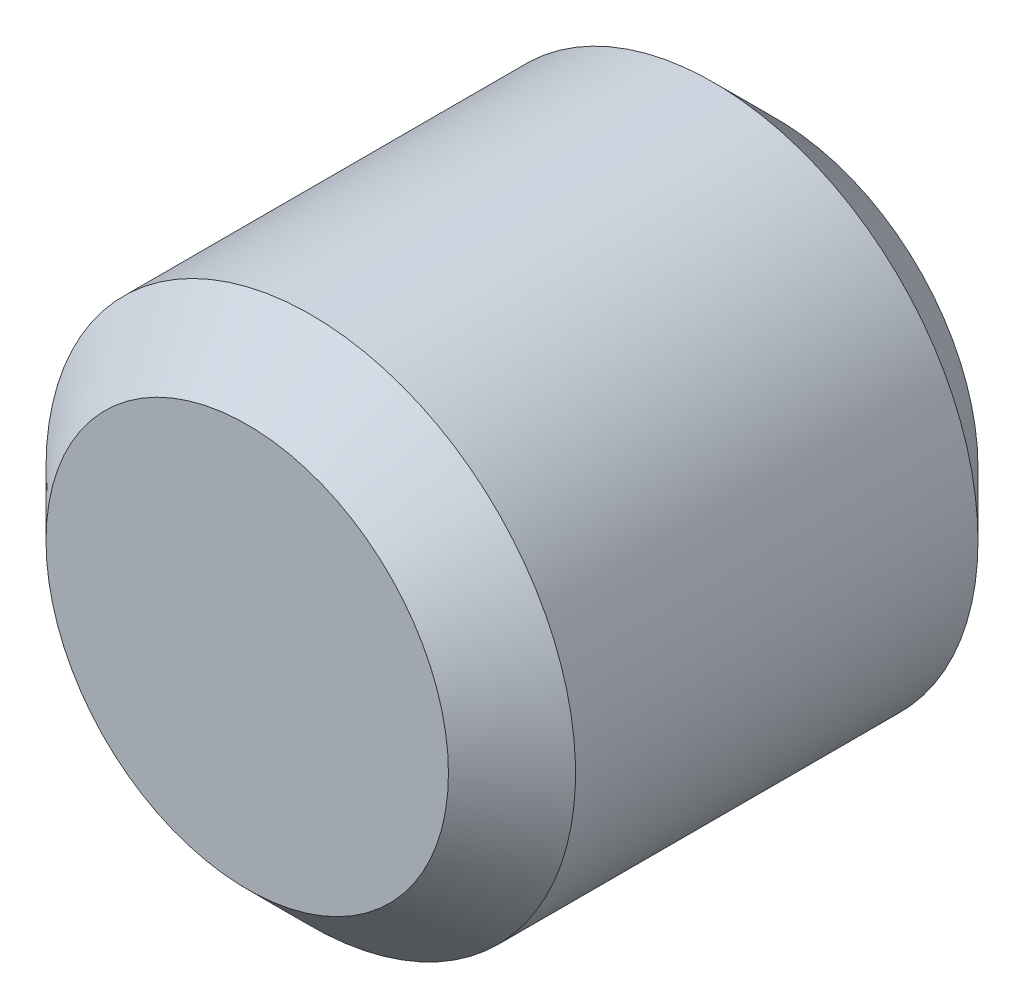
ISO-10303-21;
HEADER;
FILE_DESCRIPTION(('STEP AP214'),'2;1');
FILE_NAME('part.step','',(''),(''),'','','');
FILE_SCHEMA(('AUTOMOTIVE_DESIGN { 1 0 10303 214 1 1 1 1 }'));
ENDSEC;
DATA;
#1=APPLICATION_CONTEXT('core data for automotive mechanical design processes');
#2=APPLICATION_PROTOCOL_DEFINITION('international standard','automotive_design',2000,#1);
#3=PRODUCT_CONTEXT('',#1,'mechanical');
#4=PRODUCT('Part','Part','',(#3));
#5=PRODUCT_RELATED_PRODUCT_CATEGORY('part','',(#4));
#6=PRODUCT_DEFINITION_FORMATION('','',#4);
#7=PRODUCT_DEFINITION_CONTEXT('part definition',#1,'design');
#8=PRODUCT_DEFINITION('design','',#6,#7);
#9=PRODUCT_DEFINITION_SHAPE('','',#8);
#10=(LENGTH_UNIT() NAMED_UNIT(*) SI_UNIT(.MILLI.,.METRE.));
#11=(NAMED_UNIT(*) PLANE_ANGLE_UNIT() SI_UNIT($,.RADIAN.));
#12=(NAMED_UNIT(*) SI_UNIT($,.STERADIAN.) SOLID_ANGLE_UNIT());
#13=UNCERTAINTY_MEASURE_WITH_UNIT(LENGTH_MEASURE(1.E-05),#10,'distance_accuracy_value','');
#14=(GEOMETRIC_REPRESENTATION_CONTEXT(3) GLOBAL_UNCERTAINTY_ASSIGNED_CONTEXT((#13)) GLOBAL_UNIT_ASSIGNED_CONTEXT((#10,
#11,#12)) REPRESENTATION_CONTEXT('',''));
#15=CARTESIAN_POINT('',(0.,0.,0.));
#16=DIRECTION('',(0.,0.,1.));
#17=DIRECTION('',(1.,0.,0.));
#18=AXIS2_PLACEMENT_3D('',#15,#16,#17);
#19=CARTESIAN_POINT('',(-0.862364792336765,-0.8274298420525,0.));
#20=DIRECTION('',(0.,-1.,0.));
#21=DIRECTION('',(0.,0.,-1.));
#22=AXIS2_PLACEMENT_3D('',#19,#20,#21);
#23=PLANE('',#22);
#24=DIRECTION('',(0.,0.,1.));
#25=VECTOR('',#24,1.);
#26=CARTESIAN_POINT('',(-0.86236479233677,-0.827429842052503,0.));
#27=LINE('',#26,#25);
#28=CARTESIAN_POINT('',(-0.862364792336766,-0.827429842052501,-3.175));
#29=VERTEX_POINT('',#28);
#30=CARTESIAN_POINT('',(-0.862364792336766,-0.827429842052501,0.));
#31=VERTEX_POINT('',#30);
#32=EDGE_CURVE('E83',#29,#31,#27,.T.);
#33=ORIENTED_EDGE('',*,*,#32,.T.);
#34=DIRECTION('',(1.,0.,0.));
#35=VECTOR('',#34,1.);
#36=CARTESIAN_POINT('',(-0.862364792336765,-0.8274298420525,0.));
#37=LINE('',#36,#35);
#38=CARTESIAN_POINT('',(0.725135207663235,-0.8274298420525,0.));
#39=VERTEX_POINT('',#38);
#40=EDGE_CURVE('E72',#39,#31,#37,.F.);
#41=ORIENTED_EDGE('',*,*,#40,.F.);
#42=DIRECTION('',(0.,0.,1.));
#43=VECTOR('',#42,1.);
#44=CARTESIAN_POINT('',(0.725135207663235,-0.8274298420525,0.));
#45=LINE('',#44,#43);
#46=CARTESIAN_POINT('',(0.725135207663235,-0.8274298420525,-3.175));
#47=VERTEX_POINT('',#46);
#48=EDGE_CURVE('E91',#39,#47,#45,.F.);
#49=ORIENTED_EDGE('',*,*,#48,.T.);
#50=DIRECTION('',(1.,0.,0.));
#51=VECTOR('',#50,1.);
#52=CARTESIAN_POINT('',(-0.862364792336765,-0.8274298420525,-3.175));
#53=LINE('',#52,#51);
#54=EDGE_CURVE('E67',#29,#47,#53,.T.);
#55=ORIENTED_EDGE('',*,*,#54,.F.);
#56=EDGE_LOOP('',(#33,#41,#49,#55));
#57=FACE_BOUND('',#56,.T.);
#58=ADVANCED_FACE('F17',(#57),#23,.F.);
#59=CARTESIAN_POINT('',(-1.65611479233677,0.547385486455286,0.));
#60=DIRECTION('',(-0.866025403784439,-0.5,0.));
#61=DIRECTION('',(0.5,-0.866025403784439,0.));
#62=AXIS2_PLACEMENT_3D('',#59,#60,#61);
#63=PLANE('',#62);
#64=DIRECTION('',(0.,0.,1.));
#65=VECTOR('',#64,1.);
#66=CARTESIAN_POINT('',(-1.65611479233677,0.547385486455289,0.));
#67=LINE('',#66,#65);
#68=CARTESIAN_POINT('',(-1.65611479233677,0.547385486455287,-3.175));
#69=VERTEX_POINT('',#68);
#70=CARTESIAN_POINT('',(-1.65611479233677,0.547385486455287,0.));
#71=VERTEX_POINT('',#70);
#72=EDGE_CURVE('E87',#69,#71,#67,.T.);
#73=ORIENTED_EDGE('',*,*,#72,.T.);
#74=DIRECTION('',(0.5,-0.866025403784439,0.));
#75=VECTOR('',#74,1.);
#76=CARTESIAN_POINT('',(-1.65611479233677,0.547385486455286,0.));
#77=LINE('',#76,#75);
#78=EDGE_CURVE('E77',#31,#71,#77,.F.);
#79=ORIENTED_EDGE('',*,*,#78,.F.);
#80=ORIENTED_EDGE('',*,*,#32,.F.);
#81=DIRECTION('',(0.5,-0.866025403784439,0.));
#82=VECTOR('',#81,1.);
#83=CARTESIAN_POINT('',(-1.65611479233677,0.547385486455286,-3.175));
#84=LINE('',#83,#82);
#85=EDGE_CURVE('E89',#69,#29,#84,.T.);
#86=ORIENTED_EDGE('',*,*,#85,.F.);
#87=EDGE_LOOP('',(#73,#79,#80,#86));
#88=FACE_BOUND('',#87,.T.);
#89=ADVANCED_FACE('F86',(#88),#63,.F.);
#90=CARTESIAN_POINT('',(0.725135207663235,-0.8274298420525,0.));
#91=DIRECTION('',(0.866025403784439,-0.5,0.));
#92=DIRECTION('',(0.5,0.866025403784439,0.));
#93=AXIS2_PLACEMENT_3D('',#90,#91,#92);
#94=PLANE('',#93);
#95=ORIENTED_EDGE('',*,*,#48,.F.);
#96=DIRECTION('',(0.500000000000003,0.866025403784437,0.));
#97=VECTOR('',#96,1.);
#98=CARTESIAN_POINT('',(0.725135207663235,-0.8274298420525,0.));
#99=LINE('',#98,#97);
#100=CARTESIAN_POINT('',(1.51888520766323,0.547385486455286,0.));
#101=VERTEX_POINT('',#100);
#102=EDGE_CURVE('E79',#39,#101,#99,.T.);
#103=ORIENTED_EDGE('',*,*,#102,.T.);
#104=DIRECTION('',(0.,0.,1.));
#105=VECTOR('',#104,1.);
#106=CARTESIAN_POINT('',(1.51888520766323,0.547385486455286,0.));
#107=LINE('',#106,#105);
#108=CARTESIAN_POINT('',(1.51888520766323,0.547385486455288,-3.175));
#109=VERTEX_POINT('',#108);
#110=EDGE_CURVE('E120',#101,#109,#107,.F.);
#111=ORIENTED_EDGE('',*,*,#110,.T.);
#112=DIRECTION('',(0.5,0.866025403784439,0.));
#113=VECTOR('',#112,1.);
#114=CARTESIAN_POINT('',(0.725135207663235,-0.8274298420525,-3.175));
#115=LINE('',#114,#113);
#116=EDGE_CURVE('E130',#47,#109,#115,.T.);
#117=ORIENTED_EDGE('',*,*,#116,.F.);
#118=EDGE_LOOP('',(#95,#103,#111,#117));
#119=FACE_BOUND('',#118,.T.);
#120=ADVANCED_FACE('F133',(#119),#94,.F.);
#121=CARTESIAN_POINT('',(-0.862364792336765,1.9222008149631,0.));
#122=DIRECTION('',(-0.866025403784439,0.5,0.));
#123=DIRECTION('',(-0.5,-0.866025403784439,0.));
#124=AXIS2_PLACEMENT_3D('',#121,#122,#123);
#125=PLANE('',#124);
#126=DIRECTION('',(0.,0.,1.));
#127=VECTOR('',#126,1.);
#128=CARTESIAN_POINT('',(-0.862364792336765,1.9222008149631,0.));
#129=LINE('',#128,#127);
#130=CARTESIAN_POINT('',(-0.862364792336765,1.9222008149631,-3.175));
#131=VERTEX_POINT('',#130);
#132=CARTESIAN_POINT('',(-0.862364792336765,1.9222008149631,0.));
#133=VERTEX_POINT('',#132);
#134=EDGE_CURVE('E116',#131,#133,#129,.T.);
#135=ORIENTED_EDGE('',*,*,#134,.T.);
#136=DIRECTION('',(-0.499999999999996,-0.866025403784441,0.));
#137=VECTOR('',#136,1.);
#138=CARTESIAN_POINT('',(-0.862364792336765,1.9222008149631,0.));
#139=LINE('',#138,#137);
#140=EDGE_CURVE('E126',#133,#71,#139,.T.);
#141=ORIENTED_EDGE('',*,*,#140,.T.);
#142=ORIENTED_EDGE('',*,*,#72,.F.);
#143=DIRECTION('',(-0.5,-0.866025403784439,0.));
#144=VECTOR('',#143,1.);
#145=CARTESIAN_POINT('',(-0.862364792336765,1.9222008149631,-3.175));
#146=LINE('',#145,#144);
#147=EDGE_CURVE('E35',#131,#69,#146,.T.);
#148=ORIENTED_EDGE('',*,*,#147,.F.);
#149=EDGE_LOOP('',(#135,#141,#142,#148));
#150=FACE_BOUND('',#149,.T.);
#151=ADVANCED_FACE('F139',(#150),#125,.F.);
#152=CARTESIAN_POINT('',(0.220021571299615,0.547385486455286,0.));
#153=DIRECTION('',(0.,0.,1.));
#154=DIRECTION('',(1.,0.,0.));
#155=AXIS2_PLACEMENT_3D('',#152,#153,#154);
#156=PLANE('',#155);
#157=DIRECTION('',(-0.5,0.866025403784439,0.));
#158=VECTOR('',#157,1.);
#159=CARTESIAN_POINT('',(1.51888520766323,0.547385486455286,0.));
#160=LINE('',#159,#158);
#161=CARTESIAN_POINT('',(0.725135207663233,1.9222008149631,0.));
#162=VERTEX_POINT('',#161);
#163=EDGE_CURVE('E123',#162,#101,#160,.F.);
#164=ORIENTED_EDGE('',*,*,#163,.T.);
#165=ORIENTED_EDGE('',*,*,#102,.F.);
#166=ORIENTED_EDGE('',*,*,#40,.T.);
#167=ORIENTED_EDGE('',*,*,#78,.T.);
#168=ORIENTED_EDGE('',*,*,#140,.F.);
#169=DIRECTION('',(1.,0.,0.));
#170=VECTOR('',#169,1.);
#171=CARTESIAN_POINT('',(0.725135207663235,1.9222008149631,0.));
#172=LINE('',#171,#170);
#173=EDGE_CURVE('E112',#133,#162,#172,.T.);
#174=ORIENTED_EDGE('',*,*,#173,.T.);
#175=EDGE_LOOP('',(#164,#165,#166,#167,#168,#174));
#176=FACE_BOUND('',#175,.T.);
#177=ADVANCED_FACE('F74',(#176),#156,.F.);
#178=CARTESIAN_POINT('',(1.51888520766323,0.547385486455286,0.));
#179=DIRECTION('',(0.866025403784439,0.5,0.));
#180=DIRECTION('',(-0.5,0.866025403784439,0.));
#181=AXIS2_PLACEMENT_3D('',#178,#179,#180);
#182=PLANE('',#181);
#183=ORIENTED_EDGE('',*,*,#110,.F.);
#184=ORIENTED_EDGE('',*,*,#163,.F.);
#185=DIRECTION('',(0.,0.,1.));
#186=VECTOR('',#185,1.);
#187=CARTESIAN_POINT('',(0.725135207663235,1.9222008149631,0.));
#188=LINE('',#187,#186);
#189=CARTESIAN_POINT('',(0.725135207663232,1.9222008149631,-3.175));
#190=VERTEX_POINT('',#189);
#191=EDGE_CURVE('E106',#162,#190,#188,.F.);
#192=ORIENTED_EDGE('',*,*,#191,.T.);
#193=DIRECTION('',(-0.5,0.866025403784439,0.));
#194=VECTOR('',#193,1.);
#195=CARTESIAN_POINT('',(1.51888520766323,0.547385486455286,-3.175));
#196=LINE('',#195,#194);
#197=EDGE_CURVE('E117',#109,#190,#196,.T.);
#198=ORIENTED_EDGE('',*,*,#197,.F.);
#199=EDGE_LOOP('',(#183,#184,#192,#198));
#200=FACE_BOUND('',#199,.T.);
#201=ADVANCED_FACE('F144',(#200),#182,.F.);
#202=CARTESIAN_POINT('',(0.725135207663235,1.9222008149631,0.));
#203=DIRECTION('',(0.,1.,0.));
#204=DIRECTION('',(0.,0.,1.));
#205=AXIS2_PLACEMENT_3D('',#202,#203,#204);
#206=PLANE('',#205);
#207=ORIENTED_EDGE('',*,*,#191,.F.);
#208=ORIENTED_EDGE('',*,*,#173,.F.);
#209=ORIENTED_EDGE('',*,*,#134,.F.);
#210=DIRECTION('',(1.,0.,0.));
#211=VECTOR('',#210,1.);
#212=CARTESIAN_POINT('',(0.220021571299615,1.9222008149631,-3.175));
#213=LINE('',#212,#211);
#214=EDGE_CURVE('E102',#131,#190,#213,.T.);
#215=ORIENTED_EDGE('',*,*,#214,.T.);
#216=EDGE_LOOP('',(#207,#208,#209,#215));
#217=FACE_BOUND('',#216,.T.);
#218=ADVANCED_FACE('F142',(#217),#206,.F.);
#219=CARTESIAN_POINT('',(0.220021571299615,0.547385486455286,3.175));
#220=DIRECTION('',(0.,0.,1.));
#221=DIRECTION('',(1.,0.,0.));
#222=AXIS2_PLACEMENT_3D('',#219,#220,#221);
#223=PLANE('',#222);
#224=CARTESIAN_POINT('',(-0.0686147923367652,0.547385486455286,3.17500000033988));
#225=DIRECTION('',(0.,0.,-1.));
#226=DIRECTION('',(-1.,0.,0.));
#227=AXIS2_PLACEMENT_3D('',#224,#225,#226);
#228=CIRCLE('',#227,2.41300000032042);
#229=CARTESIAN_POINT('',(-2.48161479265718,0.547385486455286,3.17500000033988));
#230=VERTEX_POINT('',#229);
#231=EDGE_CURVE('E20',#230,#230,#228,.T.);
#232=ORIENTED_EDGE('',*,*,#231,.F.);
#233=EDGE_LOOP('',(#232));
#234=FACE_BOUND('',#233,.T.);
#235=ADVANCED_FACE('F152',(#234),#223,.T.);
#236=CARTESIAN_POINT('',(0.220021571299615,0.547385486455286,-3.175));
#237=DIRECTION('',(0.,0.,1.));
#238=DIRECTION('',(1.,0.,0.));
#239=AXIS2_PLACEMENT_3D('',#236,#237,#238);
#240=PLANE('',#239);
#241=ORIENTED_EDGE('',*,*,#147,.T.);
#242=ORIENTED_EDGE('',*,*,#85,.T.);
#243=ORIENTED_EDGE('',*,*,#54,.T.);
#244=ORIENTED_EDGE('',*,*,#116,.T.);
#245=ORIENTED_EDGE('',*,*,#197,.T.);
#246=ORIENTED_EDGE('',*,*,#214,.F.);
#247=EDGE_LOOP('',(#241,#242,#243,#244,#245,#246));
#248=FACE_BOUND('',#247,.T.);
#249=CARTESIAN_POINT('',(-0.0686147923367652,0.547385486455286,-3.17500000033988));
#250=DIRECTION('',(0.,0.,1.));
#251=DIRECTION('',(1.,0.,0.));
#252=AXIS2_PLACEMENT_3D('',#249,#250,#251);
#253=CIRCLE('',#252,2.41300000032042);
#254=CARTESIAN_POINT('',(2.34438520798365,0.547385486455286,-3.17500000033988));
#255=VERTEX_POINT('',#254);
#256=EDGE_CURVE('E95',#255,#255,#253,.T.);
#257=ORIENTED_EDGE('',*,*,#256,.F.);
#258=EDGE_LOOP('',(#257));
#259=FACE_BOUND('',#258,.T.);
#260=ADVANCED_FACE('F137',(#248,#259),#240,.F.);
#261=CARTESIAN_POINT('',(-0.0686147923367652,0.547385486455286,2.41299999964895));
#262=DIRECTION('',(0.,0.,-1.));
#263=DIRECTION('',(-1.,0.,0.));
#264=AXIS2_PLACEMENT_3D('',#261,#262,#263);
#265=CONICAL_SURFACE('',#264,3.17499999970395,0.785398162539575);
#266=ORIENTED_EDGE('',*,*,#231,.T.);
#267=EDGE_LOOP('',(#266));
#268=FACE_BOUND('',#267,.T.);
#269=CARTESIAN_POINT('',(-0.0686147923367652,0.547385486455286,2.413));
#270=DIRECTION('',(0.,0.,-1.));
#271=DIRECTION('',(-1.,0.,0.));
#272=AXIS2_PLACEMENT_3D('',#269,#270,#271);
#273=CIRCLE('',#272,3.175);
#274=CARTESIAN_POINT('',(-3.24361479233677,0.547385486455286,2.413));
#275=VERTEX_POINT('',#274);
#276=EDGE_CURVE('E26',#275,#275,#273,.T.);
#277=ORIENTED_EDGE('',*,*,#276,.F.);
#278=EDGE_LOOP('',(#277));
#279=FACE_BOUND('',#278,.T.);
#280=ADVANCED_FACE('F163',(#268,#279),#265,.T.);
#281=CARTESIAN_POINT('',(-0.0686147923367652,0.547385486455286,-2.41299999964895));
#282=DIRECTION('',(0.,0.,1.));
#283=DIRECTION('',(1.,0.,0.));
#284=AXIS2_PLACEMENT_3D('',#281,#282,#283);
#285=CONICAL_SURFACE('',#284,3.17499999970395,0.785398162539575);
#286=ORIENTED_EDGE('',*,*,#256,.T.);
#287=EDGE_LOOP('',(#286));
#288=FACE_BOUND('',#287,.T.);
#289=CARTESIAN_POINT('',(-0.0686147923367652,0.547385486455286,-2.413));
#290=DIRECTION('',(0.,0.,-1.));
#291=DIRECTION('',(-1.,0.,0.));
#292=AXIS2_PLACEMENT_3D('',#289,#290,#291);
#293=CIRCLE('',#292,3.175);
#294=CARTESIAN_POINT('',(-3.24361479233677,0.547385486455286,-2.413));
#295=VERTEX_POINT('',#294);
#296=EDGE_CURVE('E11',#295,#295,#293,.F.);
#297=ORIENTED_EDGE('',*,*,#296,.F.);
#298=EDGE_LOOP('',(#297));
#299=FACE_BOUND('',#298,.T.);
#300=ADVANCED_FACE('F157',(#288,#299),#285,.T.);
#301=CARTESIAN_POINT('',(-0.0686147923367652,0.547385486455286,0.));
#302=DIRECTION('',(0.,0.,-1.));
#303=DIRECTION('',(-1.,0.,0.));
#304=AXIS2_PLACEMENT_3D('',#301,#302,#303);
#305=CYLINDRICAL_SURFACE('',#304,3.175);
#306=ORIENTED_EDGE('',*,*,#276,.T.);
#307=EDGE_LOOP('',(#306));
#308=FACE_BOUND('',#307,.T.);
#309=ORIENTED_EDGE('',*,*,#296,.T.);
#310=EDGE_LOOP('',(#309));
#311=FACE_BOUND('',#310,.T.);
#312=ADVANCED_FACE('F155',(#308,#311),#305,.T.);
#313=CLOSED_SHELL('',(#58,#89,#120,#151,#177,#201,#218,#235,#260,#280,#300,#312));
#314=MANIFOLD_SOLID_BREP('B1',#313);
#315=ADVANCED_BREP_SHAPE_REPRESENTATION('',(#18,#314),#14);
#316=SHAPE_DEFINITION_REPRESENTATION(#9,#315);
ENDSEC;
END-ISO-10303-21;
